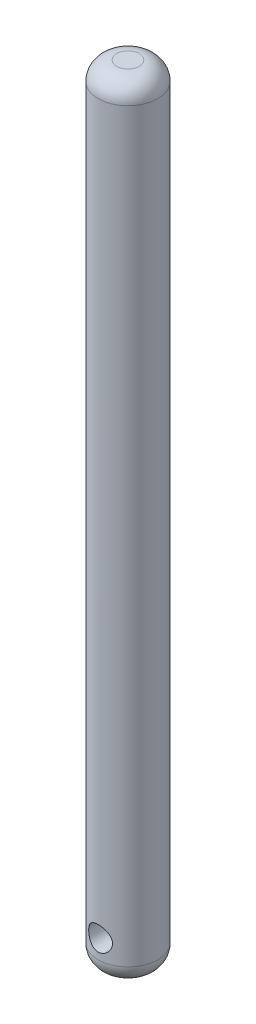
ISO-10303-21;
HEADER;
FILE_DESCRIPTION(('STEP AP214'),'2;1');
FILE_NAME('part.step','',(''),(''),'','','');
FILE_SCHEMA(('AUTOMOTIVE_DESIGN { 1 0 10303 214 1 1 1 1 }'));
ENDSEC;
DATA;
#1=APPLICATION_CONTEXT('core data for automotive mechanical design processes');
#2=APPLICATION_PROTOCOL_DEFINITION('international standard','automotive_design',2000,#1);
#3=PRODUCT_CONTEXT('',#1,'mechanical');
#4=PRODUCT('Part','Part','',(#3));
#5=PRODUCT_RELATED_PRODUCT_CATEGORY('part','',(#4));
#6=PRODUCT_DEFINITION_FORMATION('','',#4);
#7=PRODUCT_DEFINITION_CONTEXT('part definition',#1,'design');
#8=PRODUCT_DEFINITION('design','',#6,#7);
#9=PRODUCT_DEFINITION_SHAPE('','',#8);
#10=(LENGTH_UNIT() NAMED_UNIT(*) SI_UNIT(.MILLI.,.METRE.));
#11=(NAMED_UNIT(*) PLANE_ANGLE_UNIT() SI_UNIT($,.RADIAN.));
#12=(NAMED_UNIT(*) SI_UNIT($,.STERADIAN.) SOLID_ANGLE_UNIT());
#13=UNCERTAINTY_MEASURE_WITH_UNIT(LENGTH_MEASURE(1.E-05),#10,'distance_accuracy_value','');
#14=(GEOMETRIC_REPRESENTATION_CONTEXT(3) GLOBAL_UNCERTAINTY_ASSIGNED_CONTEXT((#13)) GLOBAL_UNIT_ASSIGNED_CONTEXT((#10,
#11,#12)) REPRESENTATION_CONTEXT('',''));
#15=CARTESIAN_POINT('',(0.,0.,0.));
#16=DIRECTION('',(0.,0.,1.));
#17=DIRECTION('',(1.,0.,0.));
#18=AXIS2_PLACEMENT_3D('',#15,#16,#17);
#19=CARTESIAN_POINT('',(0.,105.,0.));
#20=DIRECTION('',(0.,-1.,0.));
#21=DIRECTION('',(0.,0.,-1.));
#22=AXIS2_PLACEMENT_3D('',#19,#20,#21);
#23=CYLINDRICAL_SURFACE('',#22,4.);
#24=CARTESIAN_POINT('',(0.,102.5,0.));
#25=DIRECTION('',(0.,1.,0.));
#26=DIRECTION('',(0.,0.,1.));
#27=AXIS2_PLACEMENT_3D('',#24,#25,#26);
#28=CIRCLE('',#27,4.);
#29=CARTESIAN_POINT('',(0.,102.5,4.));
#30=VERTEX_POINT('',#29);
#31=EDGE_CURVE('E63',#30,#30,#28,.F.);
#32=ORIENTED_EDGE('',*,*,#31,.T.);
#33=EDGE_LOOP('',(#32));
#34=FACE_BOUND('',#33,.T.);
#35=CARTESIAN_POINT('',(3.,5.,-2.64575131106458));
#36=CARTESIAN_POINT('',(3.00000280896557,4.92995998904541,-2.64574551021699));
#37=CARTESIAN_POINT('',(2.99754094962657,4.85994236843688,-2.64854755685349));
#38=CARTESIAN_POINT('',(2.98778335234161,4.72066163296025,-2.65954937326353));
#39=CARTESIAN_POINT('',(2.98048600162194,4.65139877766468,-2.66775094392579));
#40=CARTESIAN_POINT('',(2.95155901854998,4.44548737873926,-2.69984445943126));
#41=CARTESIAN_POINT('',(2.92289529116371,4.31092605451994,-2.73122303815329));
#42=CARTESIAN_POINT('',(2.84967902852603,4.05280189927761,-2.80749414131083));
#43=CARTESIAN_POINT('',(2.80535116546462,3.9291129376528,-2.85219424245674));
#44=CARTESIAN_POINT('',(2.70261160960258,3.69131859878307,-2.94973182273596));
#45=CARTESIAN_POINT('',(2.64420161900243,3.57721206549225,-3.0025683180905));
#46=CARTESIAN_POINT('',(2.50080271595863,3.33577485434093,-3.12354326851477));
#47=CARTESIAN_POINT('',(2.41280926238807,3.21068001411759,-3.19256884637289));
#48=CARTESIAN_POINT('',(2.2186541254275,2.97493316138652,-3.33043252944682));
#49=CARTESIAN_POINT('',(2.11246568694302,2.86430284695807,-3.3992702047211));
#50=CARTESIAN_POINT('',(1.92836490190184,2.69999689071412,-3.50539769561967));
#51=CARTESIAN_POINT('',(1.85597029075026,2.6411504858405,-3.54435965000119));
#52=CARTESIAN_POINT('',(1.70504181430758,2.52985450580047,-3.6193818859952));
#53=CARTESIAN_POINT('',(1.62651080993558,2.47740197852736,-3.6554435040806));
#54=CARTESIAN_POINT('',(1.4637040910827,2.37958607271246,-3.72361957309374));
#55=CARTESIAN_POINT('',(1.37943756818546,2.33421171798063,-3.75574011862965));
#56=CARTESIAN_POINT('',(1.20559494807532,2.25121471754754,-3.81509912700353));
#57=CARTESIAN_POINT('',(1.11602169211667,2.2135879711787,-3.84234017147395));
#58=CARTESIAN_POINT('',(0.895799479373826,2.13362089025798,-3.90065407398258));
#59=CARTESIAN_POINT('',(0.76290855456055,2.0952955212933,-3.92898588633407));
#60=CARTESIAN_POINT('',(0.491088777779696,2.03721006321039,-3.97212104358515));
#61=CARTESIAN_POINT('',(0.35216528171301,2.0174338444641,-3.98693614179333));
#62=CARTESIAN_POINT('',(0.0717346069513418,1.99755914234438,-4.00182527262811));
#63=CARTESIAN_POINT('',(-0.0697783346711344,1.99751178988896,-4.00186100185061));
#64=CARTESIAN_POINT('',(-0.350633497188307,2.01723517475694,-3.9870847294994));
#65=CARTESIAN_POINT('',(-0.489975207798215,2.03701050155649,-3.97226928948599));
#66=CARTESIAN_POINT('',(-0.757778086122694,2.09416227912871,-3.92982740624245));
#67=CARTESIAN_POINT('',(-0.886448455408855,2.13091270062485,-3.9026571142668));
#68=CARTESIAN_POINT('',(-1.13536105117421,2.21999123650333,-3.83764561419608));
#69=CARTESIAN_POINT('',(-1.25560143283418,2.27232274758751,-3.79980207941238));
#70=CARTESIAN_POINT('',(-1.49843381849743,2.39705924518456,-3.71122090691329));
#71=CARTESIAN_POINT('',(-1.61987076262547,2.47102419725178,-3.65953080871578));
#72=CARTESIAN_POINT('',(-1.84913450790411,2.63346740392333,-3.54921405312389));
#73=CARTESIAN_POINT('',(-1.95694957120903,2.72195802624154,-3.49058149661275));
#74=CARTESIAN_POINT('',(-2.17816408331313,2.93044669902799,-3.35787531624607));
#75=CARTESIAN_POINT('',(-2.28848985950528,3.05321842038866,-3.28303311698988));
#76=CARTESIAN_POINT('',(-2.48801751171524,3.31566916690786,-3.13451916601302));
#77=CARTESIAN_POINT('',(-2.57720932423716,3.45535619909312,-3.06084798741906));
#78=CARTESIAN_POINT('',(-2.71746412822589,3.72196374045673,-2.93638851986388));
#79=CARTESIAN_POINT('',(-2.77257733772077,3.8459740902602,-2.88395199558712));
#80=CARTESIAN_POINT('',(-2.86638794181777,4.10413056317908,-2.79073482535992));
#81=CARTESIAN_POINT('',(-2.90512243472909,4.2382529607061,-2.74992790713867));
#82=CARTESIAN_POINT('',(-2.95804770816484,4.48737388693396,-2.69280101182057));
#83=CARTESIAN_POINT('',(-2.97558139385094,4.60089416062302,-2.67323078916896));
#84=CARTESIAN_POINT('',(-2.99743520848149,4.83071093595373,-2.6487117707326));
#85=CARTESIAN_POINT('',(-3.0017722429667,4.94700369316075,-2.64374426844221));
#86=CARTESIAN_POINT('',(-2.99690541681497,5.17895797010677,-2.64925736853119));
#87=CARTESIAN_POINT('',(-2.98769657209907,5.29461924177816,-2.6597436569903));
#88=CARTESIAN_POINT('',(-2.95645049123765,5.52215235481211,-2.6944244027003));
#89=CARTESIAN_POINT('',(-2.93439135868922,5.63401738236658,-2.71864225613374));
#90=CARTESIAN_POINT('',(-2.86827946945847,5.89267583361217,-2.78855502614561));
#91=CARTESIAN_POINT('',(-2.81908501412404,6.03687078522466,-2.83889586236445));
#92=CARTESIAN_POINT('',(-2.7017763357747,6.31261645196258,-2.95075783431285));
#93=CARTESIAN_POINT('',(-2.63362727745669,6.44414328026578,-3.01229948253766));
#94=CARTESIAN_POINT('',(-2.47740025533046,6.69869361959231,-3.14216325235084));
#95=CARTESIAN_POINT('',(-2.38870032302784,6.82124906005961,-3.21064858311596));
#96=CARTESIAN_POINT('',(-2.19363312764518,7.05202089322889,-3.34695922368102));
#97=CARTESIAN_POINT('',(-2.08725728128942,7.16023027348303,-3.41478419579483));
#98=CARTESIAN_POINT('',(-1.90239818691814,7.32153213165692,-3.51957077757728));
#99=CARTESIAN_POINT('',(-1.82922305125998,7.37965811952591,-3.55825033527664));
#100=CARTESIAN_POINT('',(-1.67675777822378,7.48943814432249,-3.63258399954074));
#101=CARTESIAN_POINT('',(-1.5974705382896,7.54109521772846,-3.66823952301725));
#102=CARTESIAN_POINT('',(-1.4331779554337,7.63724136264881,-3.73548722322448));
#103=CARTESIAN_POINT('',(-1.34818053963821,7.68174009166811,-3.76708486273611));
#104=CARTESIAN_POINT('',(-1.17294532822088,7.76288334375196,-3.82527474095149));
#105=CARTESIAN_POINT('',(-1.0827103944274,7.7995321057078,-3.85186968010571));
#106=CARTESIAN_POINT('',(-0.861573588365194,7.87683946411381,-3.90835673615322));
#107=CARTESIAN_POINT('',(-0.728516792900294,7.91350380472521,-3.93550115203699));
#108=CARTESIAN_POINT('',(-0.456712266621215,7.96826736567963,-3.97621371280714));
#109=CARTESIAN_POINT('',(-0.31796973962831,7.98638318445571,-3.98979399550191));
#110=CARTESIAN_POINT('',(-0.0382996918456385,8.00303015435829,-4.0022690757003));
#111=CARTESIAN_POINT('',(0.102632185789828,8.00151533129432,-4.00112939966075));
#112=CARTESIAN_POINT('',(0.382019221764036,7.97887872098708,-3.98417666975469));
#113=CARTESIAN_POINT('',(0.52047371028514,7.9577517104191,-3.96835970687871));
#114=CARTESIAN_POINT('',(0.78704356261293,7.89804998722627,-3.92406786315679));
#115=CARTESIAN_POINT('',(0.915342390371115,7.8599995894081,-3.89597377375742));
#116=CARTESIAN_POINT('',(1.16332276886424,7.76842391672118,-3.82925445361189));
#117=CARTESIAN_POINT('',(1.28300246946203,7.71489533167845,-3.7906269702888));
#118=CARTESIAN_POINT('',(1.52509537227955,7.58744411218316,-3.70035282969445));
#119=CARTESIAN_POINT('',(1.64628246914878,7.51189814336095,-3.64772704497864));
#120=CARTESIAN_POINT('',(1.87482962773044,7.34626711280583,-3.53571013069578));
#121=CARTESIAN_POINT('',(1.98217681660196,7.25616868842546,-3.47631279811072));
#122=CARTESIAN_POINT('',(2.2022476229936,7.04398931120081,-3.34212703425335));
#123=CARTESIAN_POINT('',(2.31183387997299,6.91910738721411,-3.26661834639247));
#124=CARTESIAN_POINT('',(2.50950501943596,6.65226367003828,-3.11732175300603));
#125=CARTESIAN_POINT('',(2.59758202428159,6.51029564749764,-3.04353448686306));
#126=CARTESIAN_POINT('',(2.7339195725357,6.24223404800786,-2.92099172443148));
#127=CARTESIAN_POINT('',(2.78667101930056,6.11933187972561,-2.87027147723427));
#128=CARTESIAN_POINT('',(2.87610746935094,5.86383233369276,-2.78065231320264));
#129=CARTESIAN_POINT('',(2.91283513703737,5.73126181213697,-2.7417220903151));
#130=CARTESIAN_POINT('',(2.95994243938014,5.49842837153232,-2.69064580071014));
#131=CARTESIAN_POINT('',(2.97488911938738,5.40008136130464,-2.67399401036027));
#132=CARTESIAN_POINT('',(2.99491264524008,5.20113984061434,-2.65155449367014));
#133=CARTESIAN_POINT('',(2.99999596755294,5.10054684883388,-2.6457596385468));
#134=CARTESIAN_POINT('',(3.,5.,-2.64575131106458));
#135=B_SPLINE_CURVE_WITH_KNOTS('',3,(#35,#36,#37,#38,#39,#40,#41,#42,#43,#44,#45,#46,#47,#48,
#49,#50,#51,#52,#53,#54,#55,#56,#57,#58,#59,#60,#61,#62,#63,#64,#65,#66,#67,#68,#69,#70,#71,#72,
#73,#74,#75,#76,#77,#78,#79,#80,#81,#82,#83,#84,#85,#86,#87,#88,#89,#90,#91,#92,#93,#94,#95,#96,
#97,#98,#99,#100,#101,#102,#103,#104,#105,#106,#107,#108,#109,#110,#111,#112,#113,#114,#115,
#116,#117,#118,#119,#120,#121,#122,#123,#124,#125,#126,#127,#128,#129,#130,#131,#132,#133,#134),
.UNSPECIFIED.,.T.,.F.,(4,2,2,2,2,2,2,2,2,2,2,2,2,2,2,2,2,2,2,2,2,2,2,2,2,2,2,2,2,2,2,2,2,2,2,2,
2,2,2,2,2,2,2,2,2,2,2,2,2,4),(0.,0.209978661686244,0.420027392494301,0.840743284291308,
1.2556546103656,1.67051580847001,2.1722680129487,2.6747644597623,2.97770625271005,
3.28050764081971,3.58283470135667,3.88500133203435,4.30659768868619,4.72782710054931,
5.15014819769122,5.57256709596085,5.98051830103609,6.38855850530847,6.84078006547298,
7.29338868088834,7.83503352722912,8.37693577609374,8.81203137267901,9.2461361153952,
9.5942032940531,9.94182439389894,10.2895734296593,10.6379167570555,11.116643747183,
11.5962564359181,12.0929073649363,12.5898001720674,12.8928465253493,13.1957500925974,
13.4982415141315,13.8005691796994,14.2206053318566,14.6402652787517,15.0609082299889,
15.4816632434469,15.8902036618063,16.2988315155547,16.7537484577603,17.2090855228609,
17.7544990195311,18.3001119721387,18.7279130007847,19.154567923422,19.4562036495329,
19.7576412488016),.UNSPECIFIED.);
#136=CARTESIAN_POINT('',(-1.6583123951777,2.5,-3.64005494464025));
#137=VERTEX_POINT('',#136);
#138=CARTESIAN_POINT('',(1.6583123951777,2.5,-3.64005494464025));
#139=VERTEX_POINT('',#138);
#140=EDGE_CURVE('E62',#137,#139,#135,.T.);
#141=ORIENTED_EDGE('',*,*,#140,.F.);
#142=CARTESIAN_POINT('',(0.,2.5,0.));
#143=DIRECTION('',(0.,1.,0.));
#144=DIRECTION('',(0.,0.,1.));
#145=AXIS2_PLACEMENT_3D('',#142,#143,#144);
#146=CIRCLE('',#145,4.);
#147=EDGE_CURVE('E58',#137,#139,#146,.T.);
#148=ORIENTED_EDGE('',*,*,#147,.T.);
#149=EDGE_LOOP('',(#141,#148));
#150=FACE_BOUND('',#149,.T.);
#151=CARTESIAN_POINT('',(1.6,5.,3.66606055596467));
#152=CARTESIAN_POINT('',(1.59999060336303,4.91428840152009,3.66606921325137));
#153=CARTESIAN_POINT('',(1.59307185487548,4.82845557223624,3.66910881987412));
#154=CARTESIAN_POINT('',(1.56565522447418,4.65925213369835,3.68088731350276));
#155=CARTESIAN_POINT('',(1.5451226435537,4.57588838633561,3.68964076309481));
#156=CARTESIAN_POINT('',(1.49138802605496,4.41435764642396,3.71168364633037));
#157=CARTESIAN_POINT('',(1.45823372202034,4.3361723621118,3.72495597085691));
#158=CARTESIAN_POINT('',(1.38033621549729,4.18649195931231,3.75451732076224));
#159=CARTESIAN_POINT('',(1.335595543414,4.11499538467931,3.77080568723138));
#160=CARTESIAN_POINT('',(1.23305757966994,3.97659167820684,3.80560692040826));
#161=CARTESIAN_POINT('',(1.17470348618186,3.91011486165643,3.82419134366996));
#162=CARTESIAN_POINT('',(1.04776728461924,3.7875768021477,3.86089965583048));
#163=CARTESIAN_POINT('',(0.979181617340545,3.73151919896811,3.87902338189097));
#164=CARTESIAN_POINT('',(0.830405048285103,3.62927488241384,3.91362726325483));
#165=CARTESIAN_POINT('',(0.749863172489826,3.58356455882348,3.93001442946854));
#166=CARTESIAN_POINT('',(0.581460258300097,3.50652514528815,3.95843142105237));
#167=CARTESIAN_POINT('',(0.493602215430371,3.47519020337444,3.97046301907739));
#168=CARTESIAN_POINT('',(0.317573141471115,3.42932681085008,3.98830660006628));
#169=CARTESIAN_POINT('',(0.229623187843686,3.41405814872879,3.99439149420285));
#170=CARTESIAN_POINT('',(0.0522130629101227,3.39837721146985,4.00064248546162));
#171=CARTESIAN_POINT('',(-0.0372465326603206,3.39795939525212,4.0008107901545));
#172=CARTESIAN_POINT('',(-0.209785995772248,3.41158621581999,3.99537570257428));
#173=CARTESIAN_POINT('',(-0.292941962299225,3.42481981819754,3.99009597417469));
#174=CARTESIAN_POINT('',(-0.455738487374669,3.4639943010486,3.97479433175032));
#175=CARTESIAN_POINT('',(-0.535378787512125,3.48993611392031,3.9647720697689));
#176=CARTESIAN_POINT('',(-0.690318350809324,3.55410918630104,3.94077459566159));
#177=CARTESIAN_POINT('',(-0.765534098703706,3.59251977185242,3.9267420837344));
#178=CARTESIAN_POINT('',(-0.908646520592459,3.68037200553521,3.89611668143758));
#179=CARTESIAN_POINT('',(-0.976540674172886,3.7298174344781,3.87952291412059));
#180=CARTESIAN_POINT('',(-1.10781506239372,3.84211930875727,3.84417309742667));
#181=CARTESIAN_POINT('',(-1.17060627621891,3.90564311406706,3.82534661216192));
#182=CARTESIAN_POINT('',(-1.28488593230826,4.04239245745677,3.78849328771823));
#183=CARTESIAN_POINT('',(-1.33637067500772,4.11562115852333,3.77046671181077));
#184=CARTESIAN_POINT('',(-1.42792335099434,4.27233521792716,3.73677517953449));
#185=CARTESIAN_POINT('',(-1.46762772138792,4.35605186438705,3.72119131345104));
#186=CARTESIAN_POINT('',(-1.53214100797301,4.52977239236961,3.69510072373859));
#187=CARTESIAN_POINT('',(-1.55695959872352,4.61977214781668,3.68459070338671));
#188=CARTESIAN_POINT('',(-1.58956395906557,4.79762862194884,3.67063807738051));
#189=CARTESIAN_POINT('',(-1.59829767744673,4.88528035769613,3.6668029315846));
#190=CARTESIAN_POINT('',(-1.60124906115921,5.06086176621436,3.66551598301678));
#191=CARTESIAN_POINT('',(-1.59547112847431,5.14879134662227,3.6680622444997));
#192=CARTESIAN_POINT('',(-1.57042631583082,5.3171671479639,3.67884835485705));
#193=CARTESIAN_POINT('',(-1.55194644961876,5.3977543499196,3.68675566238215));
#194=CARTESIAN_POINT('',(-1.50304334952902,5.55463072382881,3.70696040822297));
#195=CARTESIAN_POINT('',(-1.47261746744191,5.63091893848585,3.71925881990995));
#196=CARTESIAN_POINT('',(-1.39930851158516,5.78048188623639,3.74747025487959));
#197=CARTESIAN_POINT('',(-1.35597029461168,5.85350895095556,3.76350963711308));
#198=CARTESIAN_POINT('',(-1.2585321795535,5.99158638995333,3.7972030812627));
#199=CARTESIAN_POINT('',(-1.20442789878559,6.05663349823647,3.8148577991685));
#200=CARTESIAN_POINT('',(-1.08227536934439,6.18189872687937,3.85136732777117));
#201=CARTESIAN_POINT('',(-1.01349234355608,6.24140525223282,3.87021445828162));
#202=CARTESIAN_POINT('',(-0.866466906695076,6.34814166128827,3.9057583565405));
#203=CARTESIAN_POINT('',(-0.788224110774291,6.39537104527778,3.92245503674591));
#204=CARTESIAN_POINT('',(-0.624223947201409,6.47603810116898,3.95186972720228));
#205=CARTESIAN_POINT('',(-0.538468384795253,6.50947907533263,3.96458868992219));
#206=CARTESIAN_POINT('',(-0.36191487273538,6.5612390819261,3.98458170775432));
#207=CARTESIAN_POINT('',(-0.271119688235416,6.57956632115205,3.99185871766035));
#208=CARTESIAN_POINT('',(-0.0934532082770439,6.59960376130031,3.99983206568409));
#209=CARTESIAN_POINT('',(-0.00671239407444587,6.60232010277012,4.00092677395898));
#210=CARTESIAN_POINT('',(0.165947068586593,6.59371561657272,3.99748833902874));
#211=CARTESIAN_POINT('',(0.251865839515696,6.5823969137715,3.9929560477353));
#212=CARTESIAN_POINT('',(0.417736721557127,6.54676256931322,3.97897210691404));
#213=CARTESIAN_POINT('',(0.497791043718707,6.52285684313956,3.96967584507464));
#214=CARTESIAN_POINT('',(0.652737883807151,6.46315775635054,3.9471595826563));
#215=CARTESIAN_POINT('',(0.72762944661382,6.42736220318372,3.93393885843209));
#216=CARTESIAN_POINT('',(0.873762433484891,6.34311744120853,3.90414475488046));
#217=CARTESIAN_POINT('',(0.944696309445139,6.29417896409193,3.88744903782584));
#218=CARTESIAN_POINT('',(1.07764322281926,6.18576918465685,3.85271522549158));
#219=CARTESIAN_POINT('',(1.1396525485966,6.12629352283191,3.834676576404));
#220=CARTESIAN_POINT('',(1.25696101206879,5.99414782037996,3.79790210847537));
#221=CARTESIAN_POINT('',(1.31160710975922,5.92088890127912,3.77919226084307));
#222=CARTESIAN_POINT('',(1.40787796035152,5.76564629005699,3.74439737180144));
#223=CARTESIAN_POINT('',(1.44950118231999,5.68366157367212,3.72831263909964));
#224=CARTESIAN_POINT('',(1.51519287013865,5.52077023852154,3.70207091566326));
#225=CARTESIAN_POINT('',(1.54050201133136,5.44042781219906,3.69151134889318));
#226=CARTESIAN_POINT('',(1.57817420625471,5.27641166429573,3.67556802883171));
#227=CARTESIAN_POINT('',(1.59057333431041,5.19274790722643,3.6701698565774));
#228=CARTESIAN_POINT('',(1.59877140664814,5.07249795012966,3.66659567006107));
#229=CARTESIAN_POINT('',(1.6000039751959,5.03625982320192,3.66605689354685));
#230=CARTESIAN_POINT('',(1.6,5.,3.66606055596467));
#231=B_SPLINE_CURVE_WITH_KNOTS('',3,(#151,#152,#153,#154,#155,#156,#157,#158,#159,#160,#161,
#162,#163,#164,#165,#166,#167,#168,#169,#170,#171,#172,#173,#174,#175,#176,#177,#178,#179,#180,
#181,#182,#183,#184,#185,#186,#187,#188,#189,#190,#191,#192,#193,#194,#195,#196,#197,#198,#199,
#200,#201,#202,#203,#204,#205,#206,#207,#208,#209,#210,#211,#212,#213,#214,#215,#216,#217,#218,
#219,#220,#221,#222,#223,#224,#225,#226,#227,#228,#229,#230),.UNSPECIFIED.,.T.,.F.,(4,2,2,2,2,2,
2,2,2,2,2,2,2,2,2,2,2,2,2,2,2,2,2,2,2,2,2,2,2,2,2,2,2,2,2,2,2,2,2,4),(0.,0.257022119014123,
0.514701868657796,0.771416658634712,1.02807543059089,1.2980449462754,1.56810859478674,
1.84882135273142,2.12941973575584,2.39643346309747,2.66334756244538,2.91526915864242,
3.16720924103248,3.42294640187918,3.67877131952025,3.95139235265084,4.22410245701701,
4.50451566971661,4.78474643835289,5.04785718014744,5.3108881192156,5.55893798463324,
5.80704286916518,6.06520923717369,6.32348091615887,6.60082987392791,6.87819011877406,
7.15548389845458,7.43262700758517,7.6916883179997,7.95071041205289,8.2017759554989,
8.45288782258076,8.71509640907148,8.97741373246573,9.25597002623699,9.53455905402559,
9.78813328650469,10.040997041706,10.1497288441659),.UNSPECIFIED.);
#232=CARTESIAN_POINT('',(1.6,5.,3.66606055596467));
#233=VERTEX_POINT('',#232);
#234=EDGE_CURVE('E66',#233,#233,#231,.T.);
#235=ORIENTED_EDGE('',*,*,#234,.T.);
#236=EDGE_LOOP('',(#235));
#237=FACE_BOUND('',#236,.T.);
#238=ADVANCED_FACE('F38',(#34,#150,#237),#23,.T.);
#239=CARTESIAN_POINT('',(0.,105.,0.));
#240=DIRECTION('',(0.,1.,0.));
#241=DIRECTION('',(0.,0.,1.));
#242=AXIS2_PLACEMENT_3D('',#239,#240,#241);
#243=PLANE('',#242);
#244=CARTESIAN_POINT('',(0.,105.,0.));
#245=DIRECTION('',(0.,1.,0.));
#246=DIRECTION('',(0.,0.,1.));
#247=AXIS2_PLACEMENT_3D('',#244,#245,#246);
#248=CIRCLE('',#247,1.5);
#249=CARTESIAN_POINT('',(0.,105.,1.5));
#250=VERTEX_POINT('',#249);
#251=EDGE_CURVE('E11',#250,#250,#248,.T.);
#252=ORIENTED_EDGE('',*,*,#251,.T.);
#253=EDGE_LOOP('',(#252));
#254=FACE_BOUND('',#253,.T.);
#255=ADVANCED_FACE('F102',(#254),#243,.T.);
#256=CARTESIAN_POINT('',(0.,0.,0.));
#257=DIRECTION('',(0.,1.,0.));
#258=DIRECTION('',(0.,0.,1.));
#259=AXIS2_PLACEMENT_3D('',#256,#257,#258);
#260=PLANE('',#259);
#261=CARTESIAN_POINT('',(0.,0.,0.));
#262=DIRECTION('',(0.,1.,0.));
#263=DIRECTION('',(0.,0.,1.));
#264=AXIS2_PLACEMENT_3D('',#261,#262,#263);
#265=CIRCLE('',#264,1.5);
#266=CARTESIAN_POINT('',(0.,0.,1.5));
#267=VERTEX_POINT('',#266);
#268=EDGE_CURVE('E46',#267,#267,#265,.F.);
#269=ORIENTED_EDGE('',*,*,#268,.T.);
#270=EDGE_LOOP('',(#269));
#271=FACE_BOUND('',#270,.T.);
#272=ADVANCED_FACE('F107',(#271),#260,.F.);
#273=CARTESIAN_POINT('',(0.,5.,-4.));
#274=DIRECTION('',(0.,0.,1.));
#275=DIRECTION('',(1.,0.,0.));
#276=AXIS2_PLACEMENT_3D('',#273,#274,#275);
#277=CYLINDRICAL_SURFACE('',#276,1.6);
#278=CARTESIAN_POINT('',(0.,5.,-1.));
#279=DIRECTION('',(0.,0.,1.));
#280=DIRECTION('',(1.,0.,0.));
#281=AXIS2_PLACEMENT_3D('',#278,#279,#280);
#282=CIRCLE('',#281,1.6);
#283=CARTESIAN_POINT('',(1.6,5.,-1.));
#284=VERTEX_POINT('',#283);
#285=EDGE_CURVE('E67',#284,#284,#282,.T.);
#286=ORIENTED_EDGE('',*,*,#285,.F.);
#287=EDGE_LOOP('',(#286));
#288=FACE_BOUND('',#287,.T.);
#289=ORIENTED_EDGE('',*,*,#234,.F.);
#290=EDGE_LOOP('',(#289));
#291=FACE_BOUND('',#290,.T.);
#292=ADVANCED_FACE('F98',(#288,#291),#277,.F.);
#293=CARTESIAN_POINT('',(0.,5.,-4.001));
#294=DIRECTION('',(0.,0.,1.));
#295=DIRECTION('',(1.,0.,0.));
#296=AXIS2_PLACEMENT_3D('',#293,#294,#295);
#297=CYLINDRICAL_SURFACE('',#296,3.);
#298=CARTESIAN_POINT('',(0.,5.,-1.));
#299=DIRECTION('',(0.,0.,1.));
#300=DIRECTION('',(1.,0.,0.));
#301=AXIS2_PLACEMENT_3D('',#298,#299,#300);
#302=CIRCLE('',#301,3.);
#303=CARTESIAN_POINT('',(3.,5.,-1.));
#304=VERTEX_POINT('',#303);
#305=EDGE_CURVE('E72',#304,#304,#302,.T.);
#306=ORIENTED_EDGE('',*,*,#305,.T.);
#307=EDGE_LOOP('',(#306));
#308=FACE_BOUND('',#307,.T.);
#309=ORIENTED_EDGE('',*,*,#140,.T.);
#310=CARTESIAN_POINT('',(1.6583123951777,2.5,-3.64005494464025));
#311=CARTESIAN_POINT('',(1.60028960565932,2.46149521588321,-3.66649580605559));
#312=CARTESIAN_POINT('',(1.54034351260617,2.42465778189937,-3.69114539385595));
#313=CARTESIAN_POINT('',(1.41698902717246,2.35478820082,-3.73693238693502));
#314=CARTESIAN_POINT('',(1.35358048659043,2.32175621679578,-3.75806964172024));
#315=CARTESIAN_POINT('',(1.22369496705331,2.25997365005738,-3.79689873006862));
#316=CARTESIAN_POINT('',(1.15721820176965,2.23122276979431,-3.81459080310805));
#317=CARTESIAN_POINT('',(1.02167561405664,2.17839068378401,-3.84660999268532));
#318=CARTESIAN_POINT('',(0.952609919918899,2.15430924701153,-3.86093727570682));
#319=CARTESIAN_POINT('',(0.742092323960523,2.08953645424233,-3.89902320857673));
#320=CARTESIAN_POINT('',(0.597329223551853,2.05632108612084,-3.9178832187528));
#321=CARTESIAN_POINT('',(0.303588677592427,2.01170227044421,-3.94303346926045));
#322=CARTESIAN_POINT('',(0.154614077707955,2.00028443585877,-3.94933200067003));
#323=CARTESIAN_POINT('',(-0.141899987670436,1.99972885431459,-3.94964010514691));
#324=CARTESIAN_POINT('',(-0.289438964981961,2.01037027852399,-3.94377148000067));
#325=CARTESIAN_POINT('',(-0.58053666216254,2.05303622245811,-3.91974623035015));
#326=CARTESIAN_POINT('',(-0.724092800036127,2.08507429072706,-3.90158181994692));
#327=CARTESIAN_POINT('',(-0.935350120702987,2.1485454283049,-3.86435262610356));
#328=CARTESIAN_POINT('',(-1.00615557809391,2.17277554080312,-3.8499730718643));
#329=CARTESIAN_POINT('',(-1.14509516227333,2.22614239851143,-3.81770271002296));
#330=CARTESIAN_POINT('',(-1.21322906833117,2.25527954810523,-3.79981161301825));
#331=CARTESIAN_POINT('',(-1.34633148960364,2.31805943900151,-3.76042560546311));
#332=CARTESIAN_POINT('',(-1.41129875490399,2.35170394008465,-3.73892928651573));
#333=CARTESIAN_POINT('',(-1.53761889095409,2.42298413480549,-3.69226472896372));
#334=CARTESIAN_POINT('',(-1.5989720125421,2.46061955094639,-3.66709674561206));
#335=CARTESIAN_POINT('',(-1.6583123951777,2.5,-3.64005494464025));
#336=B_SPLINE_CURVE_WITH_KNOTS('',3,(#310,#311,#312,#313,#314,#315,#316,#317,#318,#319,#320,
#321,#322,#323,#324,#325,#326,#327,#328,#329,#330,#331,#332,#333,#334,#335),.UNSPECIFIED.,.F.,
.F.,(4,2,2,2,2,2,2,2,2,2,2,2,4),(0.,0.223397987917354,0.446805545337444,0.670197568041669,
0.893578535387297,1.34037211459618,1.78687069445834,2.22892109913468,2.67125167976321,
2.89963007264813,3.12802729517132,3.35651395086955,3.5849847298092),.UNSPECIFIED.);
#337=EDGE_CURVE('E52',#139,#137,#336,.T.);
#338=ORIENTED_EDGE('',*,*,#337,.T.);
#339=EDGE_LOOP('',(#309,#338));
#340=FACE_BOUND('',#339,.T.);
#341=ADVANCED_FACE('F65',(#308,#340),#297,.F.);
#342=CARTESIAN_POINT('',(0.,5.,-1.));
#343=DIRECTION('',(0.,0.,1.));
#344=DIRECTION('',(1.,0.,0.));
#345=AXIS2_PLACEMENT_3D('',#342,#343,#344);
#346=PLANE('',#345);
#347=ORIENTED_EDGE('',*,*,#285,.T.);
#348=EDGE_LOOP('',(#347));
#349=FACE_BOUND('',#348,.T.);
#350=ORIENTED_EDGE('',*,*,#305,.F.);
#351=EDGE_LOOP('',(#350));
#352=FACE_BOUND('',#351,.T.);
#353=ADVANCED_FACE('F89',(#349,#352),#346,.F.);
#354=CARTESIAN_POINT('',(0.,2.5,0.));
#355=DIRECTION('',(0.,1.,0.));
#356=DIRECTION('',(0.,0.,1.));
#357=AXIS2_PLACEMENT_3D('',#354,#355,#356);
#358=DEGENERATE_TOROIDAL_SURFACE('',#357,1.5,2.5,.T.);
#359=ORIENTED_EDGE('',*,*,#268,.F.);
#360=EDGE_LOOP('',(#359));
#361=FACE_BOUND('',#360,.T.);
#362=ORIENTED_EDGE('',*,*,#337,.F.);
#363=ORIENTED_EDGE('',*,*,#147,.F.);
#364=EDGE_LOOP('',(#362,#363));
#365=FACE_BOUND('',#364,.T.);
#366=ADVANCED_FACE('F57',(#361,#365),#358,.T.);
#367=CARTESIAN_POINT('',(0.,102.5,0.));
#368=DIRECTION('',(0.,1.,0.));
#369=DIRECTION('',(0.,0.,1.));
#370=AXIS2_PLACEMENT_3D('',#367,#368,#369);
#371=DEGENERATE_TOROIDAL_SURFACE('',#370,1.5,2.5,.T.);
#372=ORIENTED_EDGE('',*,*,#31,.F.);
#373=EDGE_LOOP('',(#372));
#374=FACE_BOUND('',#373,.T.);
#375=ORIENTED_EDGE('',*,*,#251,.F.);
#376=EDGE_LOOP('',(#375));
#377=FACE_BOUND('',#376,.T.);
#378=ADVANCED_FACE('F40',(#374,#377),#371,.T.);
#379=CLOSED_SHELL('',(#238,#255,#272,#292,#341,#353,#366,#378));
#380=MANIFOLD_SOLID_BREP('B2',#379);
#381=ADVANCED_BREP_SHAPE_REPRESENTATION('',(#18,#380),#14);
#382=SHAPE_DEFINITION_REPRESENTATION(#9,#381);
ENDSEC;
END-ISO-10303-21;
